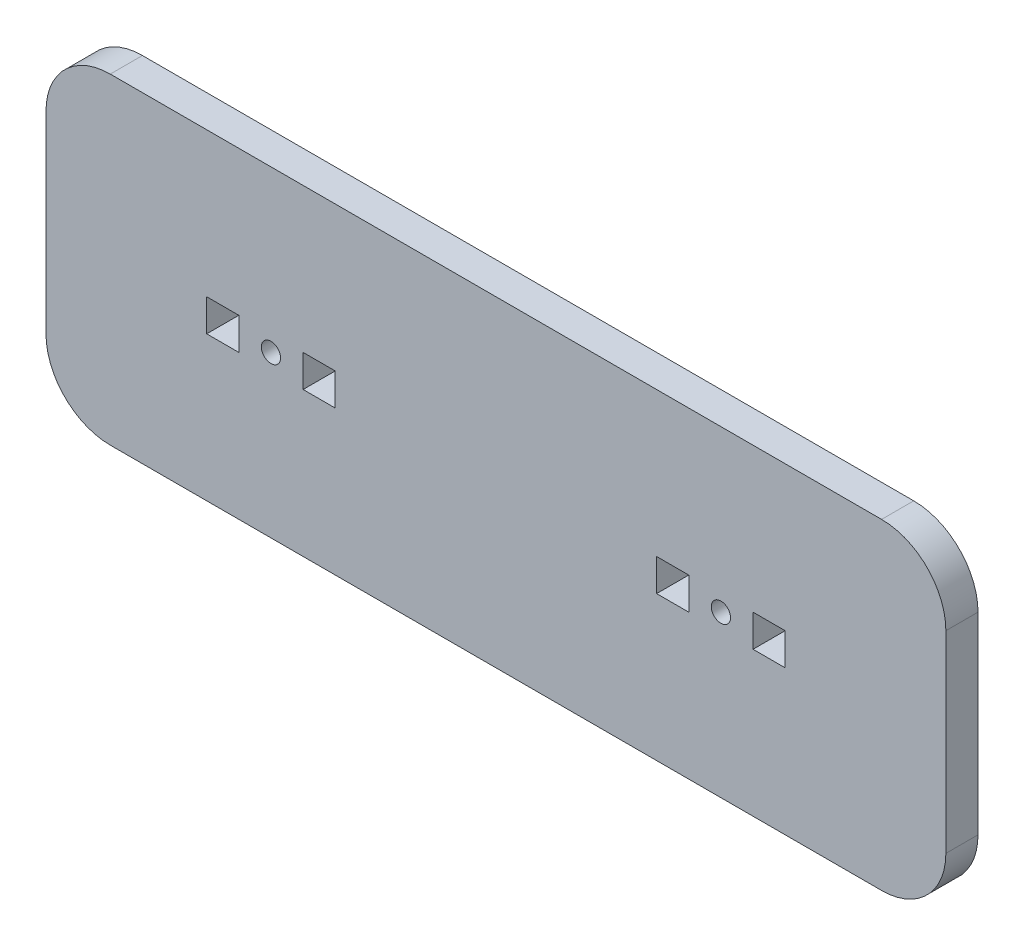
ISO-10303-21;
HEADER;
FILE_DESCRIPTION(('STEP AP214'),'2;1');
FILE_NAME('part.step','',(''),(''),'','','');
FILE_SCHEMA(('AUTOMOTIVE_DESIGN { 1 0 10303 214 1 1 1 1 }'));
ENDSEC;
DATA;
#1=APPLICATION_CONTEXT('core data for automotive mechanical design processes');
#2=APPLICATION_PROTOCOL_DEFINITION('international standard','automotive_design',2000,#1);
#3=PRODUCT_CONTEXT('',#1,'mechanical');
#4=PRODUCT('Part','Part','',(#3));
#5=PRODUCT_RELATED_PRODUCT_CATEGORY('part','',(#4));
#6=PRODUCT_DEFINITION_FORMATION('','',#4);
#7=PRODUCT_DEFINITION_CONTEXT('part definition',#1,'design');
#8=PRODUCT_DEFINITION('design','',#6,#7);
#9=PRODUCT_DEFINITION_SHAPE('','',#8);
#10=(LENGTH_UNIT() NAMED_UNIT(*) SI_UNIT(.MILLI.,.METRE.));
#11=(NAMED_UNIT(*) PLANE_ANGLE_UNIT() SI_UNIT($,.RADIAN.));
#12=(NAMED_UNIT(*) SI_UNIT($,.STERADIAN.) SOLID_ANGLE_UNIT());
#13=UNCERTAINTY_MEASURE_WITH_UNIT(LENGTH_MEASURE(1.E-05),#10,'distance_accuracy_value','');
#14=(GEOMETRIC_REPRESENTATION_CONTEXT(3) GLOBAL_UNCERTAINTY_ASSIGNED_CONTEXT((#13)) GLOBAL_UNIT_ASSIGNED_CONTEXT((#10,
#11,#12)) REPRESENTATION_CONTEXT('',''));
#15=CARTESIAN_POINT('',(0.,0.,0.));
#16=DIRECTION('',(0.,0.,1.));
#17=DIRECTION('',(1.,0.,0.));
#18=AXIS2_PLACEMENT_3D('',#15,#16,#17);
#19=CARTESIAN_POINT('',(0.,0.,5.));
#20=DIRECTION('',(0.,0.,-1.));
#21=DIRECTION('',(-1.,0.,0.));
#22=AXIS2_PLACEMENT_3D('',#19,#20,#21);
#23=PLANE('',#22);
#24=DIRECTION('',(0.,1.,0.));
#25=VECTOR('',#24,1.);
#26=CARTESIAN_POINT('',(-39.9999999999996,2.49999999999989,5.));
#27=LINE('',#26,#25);
#28=CARTESIAN_POINT('',(-39.9999999999996,-2.50000000000011,5.));
#29=VERTEX_POINT('',#28);
#30=CARTESIAN_POINT('',(-39.9999999999996,2.49999999999989,5.));
#31=VERTEX_POINT('',#30);
#32=EDGE_CURVE('E240',#29,#31,#27,.T.);
#33=ORIENTED_EDGE('',*,*,#32,.F.);
#34=DIRECTION('',(1.,0.,0.));
#35=VECTOR('',#34,1.);
#36=CARTESIAN_POINT('',(-39.9999999999996,-2.50000000000011,5.));
#37=LINE('',#36,#35);
#38=CARTESIAN_POINT('',(-44.9999999999996,-2.50000000000011,5.));
#39=VERTEX_POINT('',#38);
#40=EDGE_CURVE('E248',#39,#29,#37,.T.);
#41=ORIENTED_EDGE('',*,*,#40,.F.);
#42=DIRECTION('',(0.,-1.,0.));
#43=VECTOR('',#42,1.);
#44=CARTESIAN_POINT('',(-44.9999999999996,2.49999999999989,5.));
#45=LINE('',#44,#43);
#46=CARTESIAN_POINT('',(-44.9999999999996,2.49999999999989,5.));
#47=VERTEX_POINT('',#46);
#48=EDGE_CURVE('E245',#47,#39,#45,.T.);
#49=ORIENTED_EDGE('',*,*,#48,.F.);
#50=DIRECTION('',(-1.,0.,0.));
#51=VECTOR('',#50,1.);
#52=CARTESIAN_POINT('',(-39.9999999999996,2.49999999999989,5.));
#53=LINE('',#52,#51);
#54=EDGE_CURVE('E242',#31,#47,#53,.T.);
#55=ORIENTED_EDGE('',*,*,#54,.F.);
#56=EDGE_LOOP('',(#33,#41,#49,#55));
#57=FACE_BOUND('',#56,.T.);
#58=DIRECTION('',(0.,1.,0.));
#59=VECTOR('',#58,1.);
#60=CARTESIAN_POINT('',(30.0000000000004,2.4999999999999,5.));
#61=LINE('',#60,#59);
#62=CARTESIAN_POINT('',(30.0000000000004,-2.5000000000001,5.));
#63=VERTEX_POINT('',#62);
#64=CARTESIAN_POINT('',(30.0000000000004,2.4999999999999,5.));
#65=VERTEX_POINT('',#64);
#66=EDGE_CURVE('E308',#63,#65,#61,.T.);
#67=ORIENTED_EDGE('',*,*,#66,.F.);
#68=DIRECTION('',(1.,0.,0.));
#69=VECTOR('',#68,1.);
#70=CARTESIAN_POINT('',(30.0000000000004,-2.5000000000001,5.));
#71=LINE('',#70,#69);
#72=CARTESIAN_POINT('',(25.0000000000004,-2.5000000000001,5.));
#73=VERTEX_POINT('',#72);
#74=EDGE_CURVE('E316',#73,#63,#71,.T.);
#75=ORIENTED_EDGE('',*,*,#74,.F.);
#76=DIRECTION('',(0.,-1.,0.));
#77=VECTOR('',#76,1.);
#78=CARTESIAN_POINT('',(25.0000000000004,2.4999999999999,5.));
#79=LINE('',#78,#77);
#80=CARTESIAN_POINT('',(25.0000000000004,2.4999999999999,5.));
#81=VERTEX_POINT('',#80);
#82=EDGE_CURVE('E313',#81,#73,#79,.T.);
#83=ORIENTED_EDGE('',*,*,#82,.F.);
#84=DIRECTION('',(-1.,0.,0.));
#85=VECTOR('',#84,1.);
#86=CARTESIAN_POINT('',(30.0000000000004,2.4999999999999,5.));
#87=LINE('',#86,#85);
#88=EDGE_CURVE('E310',#65,#81,#87,.T.);
#89=ORIENTED_EDGE('',*,*,#88,.F.);
#90=EDGE_LOOP('',(#67,#75,#83,#89));
#91=FACE_BOUND('',#90,.T.);
#92=DIRECTION('',(0.,-1.,0.));
#93=VECTOR('',#92,1.);
#94=CARTESIAN_POINT('',(-70.,-25.,5.));
#95=LINE('',#94,#93);
#96=CARTESIAN_POINT('',(-70.,15.,5.));
#97=VERTEX_POINT('',#96);
#98=CARTESIAN_POINT('',(-70.,-15.,5.));
#99=VERTEX_POINT('',#98);
#100=EDGE_CURVE('E344',#97,#99,#95,.T.);
#101=ORIENTED_EDGE('',*,*,#100,.T.);
#102=CARTESIAN_POINT('',(-60.,-15.,5.));
#103=DIRECTION('',(0.,0.,-1.));
#104=DIRECTION('',(-1.,0.,0.));
#105=AXIS2_PLACEMENT_3D('',#102,#103,#104);
#106=CIRCLE('',#105,10.);
#107=CARTESIAN_POINT('',(-60.,-25.,5.));
#108=VERTEX_POINT('',#107);
#109=EDGE_CURVE('E382',#99,#108,#106,.F.);
#110=ORIENTED_EDGE('',*,*,#109,.T.);
#111=DIRECTION('',(1.,0.,0.));
#112=VECTOR('',#111,1.);
#113=CARTESIAN_POINT('',(-70.,-25.,5.));
#114=LINE('',#113,#112);
#115=CARTESIAN_POINT('',(60.,-25.,5.));
#116=VERTEX_POINT('',#115);
#117=EDGE_CURVE('E347',#108,#116,#114,.T.);
#118=ORIENTED_EDGE('',*,*,#117,.T.);
#119=CARTESIAN_POINT('',(60.,-15.,5.));
#120=DIRECTION('',(0.,0.,-1.));
#121=DIRECTION('',(-1.,0.,0.));
#122=AXIS2_PLACEMENT_3D('',#119,#120,#121);
#123=CIRCLE('',#122,10.);
#124=CARTESIAN_POINT('',(70.,-15.,5.));
#125=VERTEX_POINT('',#124);
#126=EDGE_CURVE('E380',#116,#125,#123,.F.);
#127=ORIENTED_EDGE('',*,*,#126,.T.);
#128=DIRECTION('',(0.,1.,0.));
#129=VECTOR('',#128,1.);
#130=CARTESIAN_POINT('',(70.,-25.,5.));
#131=LINE('',#130,#129);
#132=CARTESIAN_POINT('',(70.,15.,5.));
#133=VERTEX_POINT('',#132);
#134=EDGE_CURVE('E339',#125,#133,#131,.T.);
#135=ORIENTED_EDGE('',*,*,#134,.T.);
#136=CARTESIAN_POINT('',(60.,15.,5.));
#137=DIRECTION('',(0.,0.,-1.));
#138=DIRECTION('',(-1.,0.,0.));
#139=AXIS2_PLACEMENT_3D('',#136,#137,#138);
#140=CIRCLE('',#139,10.);
#141=CARTESIAN_POINT('',(60.,25.,5.));
#142=VERTEX_POINT('',#141);
#143=EDGE_CURVE('E54',#133,#142,#140,.F.);
#144=ORIENTED_EDGE('',*,*,#143,.T.);
#145=DIRECTION('',(-1.,0.,0.));
#146=VECTOR('',#145,1.);
#147=CARTESIAN_POINT('',(-70.,25.,5.));
#148=LINE('',#147,#146);
#149=CARTESIAN_POINT('',(-60.,25.,5.));
#150=VERTEX_POINT('',#149);
#151=EDGE_CURVE('E341',#142,#150,#148,.T.);
#152=ORIENTED_EDGE('',*,*,#151,.T.);
#153=CARTESIAN_POINT('',(-60.,15.,5.));
#154=DIRECTION('',(0.,0.,-1.));
#155=DIRECTION('',(-1.,0.,0.));
#156=AXIS2_PLACEMENT_3D('',#153,#154,#155);
#157=CIRCLE('',#156,10.);
#158=EDGE_CURVE('E377',#150,#97,#157,.F.);
#159=ORIENTED_EDGE('',*,*,#158,.T.);
#160=EDGE_LOOP('',(#101,#110,#118,#127,#135,#144,#152,#159));
#161=FACE_BOUND('',#160,.T.);
#162=DIRECTION('',(0.,-1.,0.));
#163=VECTOR('',#162,1.);
#164=CARTESIAN_POINT('',(40.0000000000004,2.4999999999999,5.));
#165=LINE('',#164,#163);
#166=CARTESIAN_POINT('',(40.0000000000004,2.4999999999999,5.));
#167=VERTEX_POINT('',#166);
#168=CARTESIAN_POINT('',(40.0000000000004,-2.5000000000001,5.));
#169=VERTEX_POINT('',#168);
#170=EDGE_CURVE('E277',#167,#169,#165,.T.);
#171=ORIENTED_EDGE('',*,*,#170,.F.);
#172=DIRECTION('',(-1.,0.,0.));
#173=VECTOR('',#172,1.);
#174=CARTESIAN_POINT('',(40.0000000000004,2.4999999999999,5.));
#175=LINE('',#174,#173);
#176=CARTESIAN_POINT('',(45.0000000000004,2.4999999999999,5.));
#177=VERTEX_POINT('',#176);
#178=EDGE_CURVE('E285',#177,#167,#175,.T.);
#179=ORIENTED_EDGE('',*,*,#178,.F.);
#180=DIRECTION('',(0.,1.,0.));
#181=VECTOR('',#180,1.);
#182=CARTESIAN_POINT('',(45.0000000000004,2.4999999999999,5.));
#183=LINE('',#182,#181);
#184=CARTESIAN_POINT('',(45.0000000000004,-2.5000000000001,5.));
#185=VERTEX_POINT('',#184);
#186=EDGE_CURVE('E282',#185,#177,#183,.T.);
#187=ORIENTED_EDGE('',*,*,#186,.F.);
#188=DIRECTION('',(1.,0.,0.));
#189=VECTOR('',#188,1.);
#190=CARTESIAN_POINT('',(40.0000000000004,-2.5000000000001,5.));
#191=LINE('',#190,#189);
#192=EDGE_CURVE('E279',#169,#185,#191,.T.);
#193=ORIENTED_EDGE('',*,*,#192,.F.);
#194=EDGE_LOOP('',(#171,#179,#187,#193));
#195=FACE_BOUND('',#194,.T.);
#196=CARTESIAN_POINT('',(35.0000000000004,-1.01516726870717E-13,5.));
#197=DIRECTION('',(0.,0.,1.));
#198=DIRECTION('',(1.,0.,0.));
#199=AXIS2_PLACEMENT_3D('',#196,#197,#198);
#200=CIRCLE('',#199,1.5);
#201=CARTESIAN_POINT('',(36.5000000000004,-1.01516726870717E-13,5.));
#202=VERTEX_POINT('',#201);
#203=EDGE_CURVE('E271',#202,#202,#200,.T.);
#204=ORIENTED_EDGE('',*,*,#203,.F.);
#205=EDGE_LOOP('',(#204));
#206=FACE_BOUND('',#205,.T.);
#207=DIRECTION('',(0.,-1.,0.));
#208=VECTOR('',#207,1.);
#209=CARTESIAN_POINT('',(-29.9999999999996,2.49999999999989,5.));
#210=LINE('',#209,#208);
#211=CARTESIAN_POINT('',(-29.9999999999996,2.49999999999989,5.));
#212=VERTEX_POINT('',#211);
#213=CARTESIAN_POINT('',(-29.9999999999996,-2.50000000000011,5.));
#214=VERTEX_POINT('',#213);
#215=EDGE_CURVE('E196',#212,#214,#210,.T.);
#216=ORIENTED_EDGE('',*,*,#215,.F.);
#217=DIRECTION('',(-1.,0.,0.));
#218=VECTOR('',#217,1.);
#219=CARTESIAN_POINT('',(-29.9999999999996,2.49999999999989,5.));
#220=LINE('',#219,#218);
#221=CARTESIAN_POINT('',(-24.9999999999996,2.49999999999989,5.));
#222=VERTEX_POINT('',#221);
#223=EDGE_CURVE('E222',#222,#212,#220,.T.);
#224=ORIENTED_EDGE('',*,*,#223,.F.);
#225=DIRECTION('',(0.,1.,0.));
#226=VECTOR('',#225,1.);
#227=CARTESIAN_POINT('',(-24.9999999999996,2.49999999999989,5.));
#228=LINE('',#227,#226);
#229=CARTESIAN_POINT('',(-24.9999999999996,-2.50000000000011,5.));
#230=VERTEX_POINT('',#229);
#231=EDGE_CURVE('E220',#230,#222,#228,.T.);
#232=ORIENTED_EDGE('',*,*,#231,.F.);
#233=DIRECTION('',(1.,0.,0.));
#234=VECTOR('',#233,1.);
#235=CARTESIAN_POINT('',(-29.9999999999996,-2.50000000000011,5.));
#236=LINE('',#235,#234);
#237=EDGE_CURVE('E206',#214,#230,#236,.T.);
#238=ORIENTED_EDGE('',*,*,#237,.F.);
#239=EDGE_LOOP('',(#216,#224,#232,#238));
#240=FACE_BOUND('',#239,.T.);
#241=CARTESIAN_POINT('',(-34.9999999999996,-1.08268408934466E-13,5.));
#242=DIRECTION('',(0.,0.,1.));
#243=DIRECTION('',(1.,0.,0.));
#244=AXIS2_PLACEMENT_3D('',#241,#242,#243);
#245=CIRCLE('',#244,1.5);
#246=CARTESIAN_POINT('',(-33.4999999999996,-1.08268408934466E-13,5.));
#247=VERTEX_POINT('',#246);
#248=EDGE_CURVE('E229',#247,#247,#245,.T.);
#249=ORIENTED_EDGE('',*,*,#248,.F.);
#250=EDGE_LOOP('',(#249));
#251=FACE_BOUND('',#250,.T.);
#252=ADVANCED_FACE('F33',(#57,#91,#161,#195,#206,#240,#251),#23,.F.);
#253=CARTESIAN_POINT('',(0.,0.,0.));
#254=DIRECTION('',(0.,0.,-1.));
#255=DIRECTION('',(-1.,0.,0.));
#256=AXIS2_PLACEMENT_3D('',#253,#254,#255);
#257=PLANE('',#256);
#258=DIRECTION('',(-1.,0.,0.));
#259=VECTOR('',#258,1.);
#260=CARTESIAN_POINT('',(-29.9999999999996,2.49999999999989,0.));
#261=LINE('',#260,#259);
#262=CARTESIAN_POINT('',(-24.9999999999996,2.49999999999989,0.));
#263=VERTEX_POINT('',#262);
#264=CARTESIAN_POINT('',(-29.9999999999996,2.49999999999989,0.));
#265=VERTEX_POINT('',#264);
#266=EDGE_CURVE('E207',#263,#265,#261,.T.);
#267=ORIENTED_EDGE('',*,*,#266,.T.);
#268=DIRECTION('',(0.,-1.,0.));
#269=VECTOR('',#268,1.);
#270=CARTESIAN_POINT('',(-29.9999999999996,2.49999999999989,0.));
#271=LINE('',#270,#269);
#272=CARTESIAN_POINT('',(-29.9999999999996,-2.50000000000011,0.));
#273=VERTEX_POINT('',#272);
#274=EDGE_CURVE('E227',#265,#273,#271,.T.);
#275=ORIENTED_EDGE('',*,*,#274,.T.);
#276=DIRECTION('',(1.,0.,0.));
#277=VECTOR('',#276,1.);
#278=CARTESIAN_POINT('',(-29.9999999999996,-2.50000000000011,0.));
#279=LINE('',#278,#277);
#280=CARTESIAN_POINT('',(-24.9999999999996,-2.50000000000011,0.));
#281=VERTEX_POINT('',#280);
#282=EDGE_CURVE('E213',#273,#281,#279,.T.);
#283=ORIENTED_EDGE('',*,*,#282,.T.);
#284=DIRECTION('',(0.,1.,0.));
#285=VECTOR('',#284,1.);
#286=CARTESIAN_POINT('',(-24.9999999999996,2.49999999999989,0.));
#287=LINE('',#286,#285);
#288=EDGE_CURVE('E231',#281,#263,#287,.T.);
#289=ORIENTED_EDGE('',*,*,#288,.T.);
#290=EDGE_LOOP('',(#267,#275,#283,#289));
#291=FACE_BOUND('',#290,.T.);
#292=DIRECTION('',(1.,0.,0.));
#293=VECTOR('',#292,1.);
#294=CARTESIAN_POINT('',(-39.9999999999996,-2.50000000000011,0.));
#295=LINE('',#294,#293);
#296=CARTESIAN_POINT('',(-44.9999999999996,-2.50000000000011,0.));
#297=VERTEX_POINT('',#296);
#298=CARTESIAN_POINT('',(-39.9999999999996,-2.50000000000011,0.));
#299=VERTEX_POINT('',#298);
#300=EDGE_CURVE('E243',#297,#299,#295,.T.);
#301=ORIENTED_EDGE('',*,*,#300,.T.);
#302=DIRECTION('',(0.,1.,0.));
#303=VECTOR('',#302,1.);
#304=CARTESIAN_POINT('',(-39.9999999999996,2.49999999999989,0.));
#305=LINE('',#304,#303);
#306=CARTESIAN_POINT('',(-39.9999999999996,2.49999999999989,0.));
#307=VERTEX_POINT('',#306);
#308=EDGE_CURVE('E214',#299,#307,#305,.T.);
#309=ORIENTED_EDGE('',*,*,#308,.T.);
#310=DIRECTION('',(-1.,0.,0.));
#311=VECTOR('',#310,1.);
#312=CARTESIAN_POINT('',(-39.9999999999996,2.49999999999989,0.));
#313=LINE('',#312,#311);
#314=CARTESIAN_POINT('',(-44.9999999999996,2.49999999999989,0.));
#315=VERTEX_POINT('',#314);
#316=EDGE_CURVE('E253',#307,#315,#313,.T.);
#317=ORIENTED_EDGE('',*,*,#316,.T.);
#318=DIRECTION('',(0.,-1.,0.));
#319=VECTOR('',#318,1.);
#320=CARTESIAN_POINT('',(-44.9999999999996,2.49999999999989,0.));
#321=LINE('',#320,#319);
#322=EDGE_CURVE('E256',#315,#297,#321,.T.);
#323=ORIENTED_EDGE('',*,*,#322,.T.);
#324=EDGE_LOOP('',(#301,#309,#317,#323));
#325=FACE_BOUND('',#324,.T.);
#326=CARTESIAN_POINT('',(35.0000000000004,-1.01516726870717E-13,0.));
#327=DIRECTION('',(0.,0.,1.));
#328=DIRECTION('',(1.,0.,0.));
#329=AXIS2_PLACEMENT_3D('',#326,#327,#328);
#330=CIRCLE('',#329,1.5);
#331=CARTESIAN_POINT('',(36.5000000000004,-1.01516726870717E-13,0.));
#332=VERTEX_POINT('',#331);
#333=EDGE_CURVE('E270',#332,#332,#330,.T.);
#334=ORIENTED_EDGE('',*,*,#333,.T.);
#335=EDGE_LOOP('',(#334));
#336=FACE_BOUND('',#335,.T.);
#337=DIRECTION('',(1.,0.,0.));
#338=VECTOR('',#337,1.);
#339=CARTESIAN_POINT('',(-70.,-25.,0.));
#340=LINE('',#339,#338);
#341=CARTESIAN_POINT('',(-60.,-25.,0.));
#342=VERTEX_POINT('',#341);
#343=CARTESIAN_POINT('',(60.,-25.,0.));
#344=VERTEX_POINT('',#343);
#345=EDGE_CURVE('E342',#342,#344,#340,.T.);
#346=ORIENTED_EDGE('',*,*,#345,.F.);
#347=CARTESIAN_POINT('',(-60.,-15.,0.));
#348=DIRECTION('',(0.,0.,-1.));
#349=DIRECTION('',(-1.,0.,0.));
#350=AXIS2_PLACEMENT_3D('',#347,#348,#349);
#351=CIRCLE('',#350,10.);
#352=CARTESIAN_POINT('',(-70.,-15.,0.));
#353=VERTEX_POINT('',#352);
#354=EDGE_CURVE('E370',#342,#353,#351,.T.);
#355=ORIENTED_EDGE('',*,*,#354,.T.);
#356=DIRECTION('',(0.,-1.,0.));
#357=VECTOR('',#356,1.);
#358=CARTESIAN_POINT('',(-70.,-25.,0.));
#359=LINE('',#358,#357);
#360=CARTESIAN_POINT('',(-70.,15.,0.));
#361=VERTEX_POINT('',#360);
#362=EDGE_CURVE('E355',#361,#353,#359,.T.);
#363=ORIENTED_EDGE('',*,*,#362,.F.);
#364=CARTESIAN_POINT('',(-60.,15.,0.));
#365=DIRECTION('',(0.,0.,-1.));
#366=DIRECTION('',(-1.,0.,0.));
#367=AXIS2_PLACEMENT_3D('',#364,#365,#366);
#368=CIRCLE('',#367,10.);
#369=CARTESIAN_POINT('',(-60.,25.,0.));
#370=VERTEX_POINT('',#369);
#371=EDGE_CURVE('E364',#361,#370,#368,.T.);
#372=ORIENTED_EDGE('',*,*,#371,.T.);
#373=DIRECTION('',(-1.,0.,0.));
#374=VECTOR('',#373,1.);
#375=CARTESIAN_POINT('',(-70.,25.,0.));
#376=LINE('',#375,#374);
#377=CARTESIAN_POINT('',(60.,25.,0.));
#378=VERTEX_POINT('',#377);
#379=EDGE_CURVE('E353',#378,#370,#376,.T.);
#380=ORIENTED_EDGE('',*,*,#379,.F.);
#381=CARTESIAN_POINT('',(60.,15.,0.));
#382=DIRECTION('',(0.,0.,-1.));
#383=DIRECTION('',(-1.,0.,0.));
#384=AXIS2_PLACEMENT_3D('',#381,#382,#383);
#385=CIRCLE('',#384,10.);
#386=CARTESIAN_POINT('',(70.,15.,0.));
#387=VERTEX_POINT('',#386);
#388=EDGE_CURVE('E366',#378,#387,#385,.T.);
#389=ORIENTED_EDGE('',*,*,#388,.T.);
#390=DIRECTION('',(0.,1.,0.));
#391=VECTOR('',#390,1.);
#392=CARTESIAN_POINT('',(70.,-25.,0.));
#393=LINE('',#392,#391);
#394=CARTESIAN_POINT('',(70.,-15.,0.));
#395=VERTEX_POINT('',#394);
#396=EDGE_CURVE('E338',#395,#387,#393,.T.);
#397=ORIENTED_EDGE('',*,*,#396,.F.);
#398=CARTESIAN_POINT('',(60.,-15.,0.));
#399=DIRECTION('',(0.,0.,-1.));
#400=DIRECTION('',(-1.,0.,0.));
#401=AXIS2_PLACEMENT_3D('',#398,#399,#400);
#402=CIRCLE('',#401,10.);
#403=EDGE_CURVE('E368',#395,#344,#402,.T.);
#404=ORIENTED_EDGE('',*,*,#403,.T.);
#405=EDGE_LOOP('',(#346,#355,#363,#372,#380,#389,#397,#404));
#406=FACE_BOUND('',#405,.T.);
#407=DIRECTION('',(1.,0.,0.));
#408=VECTOR('',#407,1.);
#409=CARTESIAN_POINT('',(30.0000000000004,-2.5000000000001,0.));
#410=LINE('',#409,#408);
#411=CARTESIAN_POINT('',(25.0000000000004,-2.5000000000001,0.));
#412=VERTEX_POINT('',#411);
#413=CARTESIAN_POINT('',(30.0000000000004,-2.5000000000001,0.));
#414=VERTEX_POINT('',#413);
#415=EDGE_CURVE('E311',#412,#414,#410,.T.);
#416=ORIENTED_EDGE('',*,*,#415,.T.);
#417=DIRECTION('',(0.,1.,0.));
#418=VECTOR('',#417,1.);
#419=CARTESIAN_POINT('',(30.0000000000004,2.4999999999999,0.));
#420=LINE('',#419,#418);
#421=CARTESIAN_POINT('',(30.0000000000004,2.4999999999999,0.));
#422=VERTEX_POINT('',#421);
#423=EDGE_CURVE('E307',#414,#422,#420,.T.);
#424=ORIENTED_EDGE('',*,*,#423,.T.);
#425=DIRECTION('',(-1.,0.,0.));
#426=VECTOR('',#425,1.);
#427=CARTESIAN_POINT('',(30.0000000000004,2.4999999999999,0.));
#428=LINE('',#427,#426);
#429=CARTESIAN_POINT('',(25.0000000000004,2.4999999999999,0.));
#430=VERTEX_POINT('',#429);
#431=EDGE_CURVE('E321',#422,#430,#428,.T.);
#432=ORIENTED_EDGE('',*,*,#431,.T.);
#433=DIRECTION('',(0.,-1.,0.));
#434=VECTOR('',#433,1.);
#435=CARTESIAN_POINT('',(25.0000000000004,2.4999999999999,0.));
#436=LINE('',#435,#434);
#437=EDGE_CURVE('E324',#430,#412,#436,.T.);
#438=ORIENTED_EDGE('',*,*,#437,.T.);
#439=EDGE_LOOP('',(#416,#424,#432,#438));
#440=FACE_BOUND('',#439,.T.);
#441=DIRECTION('',(-1.,0.,0.));
#442=VECTOR('',#441,1.);
#443=CARTESIAN_POINT('',(40.0000000000004,2.4999999999999,0.));
#444=LINE('',#443,#442);
#445=CARTESIAN_POINT('',(45.0000000000004,2.4999999999999,0.));
#446=VERTEX_POINT('',#445);
#447=CARTESIAN_POINT('',(40.0000000000004,2.4999999999999,0.));
#448=VERTEX_POINT('',#447);
#449=EDGE_CURVE('E280',#446,#448,#444,.T.);
#450=ORIENTED_EDGE('',*,*,#449,.T.);
#451=DIRECTION('',(0.,-1.,0.));
#452=VECTOR('',#451,1.);
#453=CARTESIAN_POINT('',(40.0000000000004,2.4999999999999,0.));
#454=LINE('',#453,#452);
#455=CARTESIAN_POINT('',(40.0000000000004,-2.5000000000001,0.));
#456=VERTEX_POINT('',#455);
#457=EDGE_CURVE('E274',#448,#456,#454,.T.);
#458=ORIENTED_EDGE('',*,*,#457,.T.);
#459=DIRECTION('',(1.,0.,0.));
#460=VECTOR('',#459,1.);
#461=CARTESIAN_POINT('',(40.0000000000004,-2.5000000000001,0.));
#462=LINE('',#461,#460);
#463=CARTESIAN_POINT('',(45.0000000000004,-2.5000000000001,0.));
#464=VERTEX_POINT('',#463);
#465=EDGE_CURVE('E290',#456,#464,#462,.T.);
#466=ORIENTED_EDGE('',*,*,#465,.T.);
#467=DIRECTION('',(0.,1.,0.));
#468=VECTOR('',#467,1.);
#469=CARTESIAN_POINT('',(45.0000000000004,2.4999999999999,0.));
#470=LINE('',#469,#468);
#471=EDGE_CURVE('E293',#464,#446,#470,.T.);
#472=ORIENTED_EDGE('',*,*,#471,.T.);
#473=EDGE_LOOP('',(#450,#458,#466,#472));
#474=FACE_BOUND('',#473,.T.);
#475=CARTESIAN_POINT('',(-34.9999999999996,-1.08268408934466E-13,0.));
#476=DIRECTION('',(0.,0.,1.));
#477=DIRECTION('',(1.,0.,0.));
#478=AXIS2_PLACEMENT_3D('',#475,#476,#477);
#479=CIRCLE('',#478,1.5);
#480=CARTESIAN_POINT('',(-33.4999999999996,-1.08268408934466E-13,0.));
#481=VERTEX_POINT('',#480);
#482=EDGE_CURVE('E686',#481,#481,#479,.T.);
#483=ORIENTED_EDGE('',*,*,#482,.T.);
#484=EDGE_LOOP('',(#483));
#485=FACE_BOUND('',#484,.T.);
#486=ADVANCED_FACE('F398',(#291,#325,#336,#406,#440,#474,#485),#257,.T.);
#487=CARTESIAN_POINT('',(70.,-25.,5.));
#488=DIRECTION('',(-1.,0.,0.));
#489=DIRECTION('',(0.,0.,1.));
#490=AXIS2_PLACEMENT_3D('',#487,#488,#489);
#491=PLANE('',#490);
#492=ORIENTED_EDGE('',*,*,#134,.F.);
#493=DIRECTION('',(0.,0.,-1.));
#494=VECTOR('',#493,1.);
#495=CARTESIAN_POINT('',(70.,-15.,5.));
#496=LINE('',#495,#494);
#497=EDGE_CURVE('E386',#125,#395,#496,.T.);
#498=ORIENTED_EDGE('',*,*,#497,.T.);
#499=ORIENTED_EDGE('',*,*,#396,.T.);
#500=DIRECTION('',(0.,0.,-1.));
#501=VECTOR('',#500,1.);
#502=CARTESIAN_POINT('',(70.,15.,5.));
#503=LINE('',#502,#501);
#504=EDGE_CURVE('E384',#387,#133,#503,.F.);
#505=ORIENTED_EDGE('',*,*,#504,.T.);
#506=EDGE_LOOP('',(#492,#498,#499,#505));
#507=FACE_BOUND('',#506,.T.);
#508=ADVANCED_FACE('F392',(#507),#491,.F.);
#509=CARTESIAN_POINT('',(-70.,25.,5.));
#510=DIRECTION('',(0.,-1.,0.));
#511=DIRECTION('',(1.,0.,0.));
#512=AXIS2_PLACEMENT_3D('',#509,#510,#511);
#513=PLANE('',#512);
#514=ORIENTED_EDGE('',*,*,#151,.F.);
#515=DIRECTION('',(0.,0.,-1.));
#516=VECTOR('',#515,1.);
#517=CARTESIAN_POINT('',(60.,25.,5.));
#518=LINE('',#517,#516);
#519=EDGE_CURVE('E11',#142,#378,#518,.T.);
#520=ORIENTED_EDGE('',*,*,#519,.T.);
#521=ORIENTED_EDGE('',*,*,#379,.T.);
#522=DIRECTION('',(0.,0.,-1.));
#523=VECTOR('',#522,1.);
#524=CARTESIAN_POINT('',(-60.,25.,5.));
#525=LINE('',#524,#523);
#526=EDGE_CURVE('E41',#370,#150,#525,.F.);
#527=ORIENTED_EDGE('',*,*,#526,.T.);
#528=EDGE_LOOP('',(#514,#520,#521,#527));
#529=FACE_BOUND('',#528,.T.);
#530=ADVANCED_FACE('F404',(#529),#513,.F.);
#531=CARTESIAN_POINT('',(-70.,-25.,5.));
#532=DIRECTION('',(1.,0.,0.));
#533=DIRECTION('',(0.,0.,-1.));
#534=AXIS2_PLACEMENT_3D('',#531,#532,#533);
#535=PLANE('',#534);
#536=ORIENTED_EDGE('',*,*,#362,.T.);
#537=DIRECTION('',(0.,0.,-1.));
#538=VECTOR('',#537,1.);
#539=CARTESIAN_POINT('',(-70.,-15.,5.));
#540=LINE('',#539,#538);
#541=EDGE_CURVE('E375',#353,#99,#540,.F.);
#542=ORIENTED_EDGE('',*,*,#541,.T.);
#543=ORIENTED_EDGE('',*,*,#100,.F.);
#544=DIRECTION('',(0.,0.,-1.));
#545=VECTOR('',#544,1.);
#546=CARTESIAN_POINT('',(-70.,15.,5.));
#547=LINE('',#546,#545);
#548=EDGE_CURVE('E372',#97,#361,#547,.T.);
#549=ORIENTED_EDGE('',*,*,#548,.T.);
#550=EDGE_LOOP('',(#536,#542,#543,#549));
#551=FACE_BOUND('',#550,.T.);
#552=ADVANCED_FACE('F412',(#551),#535,.F.);
#553=CARTESIAN_POINT('',(-70.,-25.,5.));
#554=DIRECTION('',(0.,1.,0.));
#555=DIRECTION('',(0.,0.,1.));
#556=AXIS2_PLACEMENT_3D('',#553,#554,#555);
#557=PLANE('',#556);
#558=ORIENTED_EDGE('',*,*,#117,.F.);
#559=DIRECTION('',(0.,0.,-1.));
#560=VECTOR('',#559,1.);
#561=CARTESIAN_POINT('',(-60.,-25.,5.));
#562=LINE('',#561,#560);
#563=EDGE_CURVE('E361',#108,#342,#562,.T.);
#564=ORIENTED_EDGE('',*,*,#563,.T.);
#565=ORIENTED_EDGE('',*,*,#345,.T.);
#566=DIRECTION('',(0.,0.,-1.));
#567=VECTOR('',#566,1.);
#568=CARTESIAN_POINT('',(60.,-25.,5.));
#569=LINE('',#568,#567);
#570=EDGE_CURVE('E350',#344,#116,#569,.F.);
#571=ORIENTED_EDGE('',*,*,#570,.T.);
#572=EDGE_LOOP('',(#558,#564,#565,#571));
#573=FACE_BOUND('',#572,.T.);
#574=ADVANCED_FACE('F420',(#573),#557,.F.);
#575=CARTESIAN_POINT('',(30.0000000000004,2.4999999999999,5.));
#576=DIRECTION('',(-1.,0.,0.));
#577=DIRECTION('',(0.,0.,1.));
#578=AXIS2_PLACEMENT_3D('',#575,#576,#577);
#579=PLANE('',#578);
#580=ORIENTED_EDGE('',*,*,#423,.F.);
#581=DIRECTION('',(0.,0.,-1.));
#582=VECTOR('',#581,1.);
#583=CARTESIAN_POINT('',(30.0000000000004,-2.5000000000001,5.));
#584=LINE('',#583,#582);
#585=EDGE_CURVE('E318',#63,#414,#584,.T.);
#586=ORIENTED_EDGE('',*,*,#585,.F.);
#587=ORIENTED_EDGE('',*,*,#66,.T.);
#588=DIRECTION('',(0.,0.,-1.));
#589=VECTOR('',#588,1.);
#590=CARTESIAN_POINT('',(30.0000000000004,2.4999999999999,5.));
#591=LINE('',#590,#589);
#592=EDGE_CURVE('E335',#65,#422,#591,.T.);
#593=ORIENTED_EDGE('',*,*,#592,.T.);
#594=EDGE_LOOP('',(#580,#586,#587,#593));
#595=FACE_BOUND('',#594,.T.);
#596=ADVANCED_FACE('F442',(#595),#579,.T.);
#597=CARTESIAN_POINT('',(30.0000000000004,2.4999999999999,5.));
#598=DIRECTION('',(0.,-1.,0.));
#599=DIRECTION('',(1.,0.,0.));
#600=AXIS2_PLACEMENT_3D('',#597,#598,#599);
#601=PLANE('',#600);
#602=ORIENTED_EDGE('',*,*,#431,.F.);
#603=ORIENTED_EDGE('',*,*,#592,.F.);
#604=ORIENTED_EDGE('',*,*,#88,.T.);
#605=DIRECTION('',(0.,0.,-1.));
#606=VECTOR('',#605,1.);
#607=CARTESIAN_POINT('',(25.0000000000004,2.4999999999999,5.));
#608=LINE('',#607,#606);
#609=EDGE_CURVE('E333',#81,#430,#608,.T.);
#610=ORIENTED_EDGE('',*,*,#609,.T.);
#611=EDGE_LOOP('',(#602,#603,#604,#610));
#612=FACE_BOUND('',#611,.T.);
#613=ADVANCED_FACE('F475',(#612),#601,.T.);
#614=CARTESIAN_POINT('',(25.0000000000004,2.4999999999999,5.));
#615=DIRECTION('',(1.,0.,0.));
#616=DIRECTION('',(0.,0.,-1.));
#617=AXIS2_PLACEMENT_3D('',#614,#615,#616);
#618=PLANE('',#617);
#619=ORIENTED_EDGE('',*,*,#437,.F.);
#620=ORIENTED_EDGE('',*,*,#609,.F.);
#621=ORIENTED_EDGE('',*,*,#82,.T.);
#622=DIRECTION('',(0.,0.,-1.));
#623=VECTOR('',#622,1.);
#624=CARTESIAN_POINT('',(25.0000000000004,-2.5000000000001,5.));
#625=LINE('',#624,#623);
#626=EDGE_CURVE('E331',#73,#412,#625,.T.);
#627=ORIENTED_EDGE('',*,*,#626,.T.);
#628=EDGE_LOOP('',(#619,#620,#621,#627));
#629=FACE_BOUND('',#628,.T.);
#630=ADVANCED_FACE('F482',(#629),#618,.T.);
#631=CARTESIAN_POINT('',(30.0000000000004,-2.5000000000001,5.));
#632=DIRECTION('',(0.,1.,0.));
#633=DIRECTION('',(-1.,0.,0.));
#634=AXIS2_PLACEMENT_3D('',#631,#632,#633);
#635=PLANE('',#634);
#636=ORIENTED_EDGE('',*,*,#415,.F.);
#637=ORIENTED_EDGE('',*,*,#626,.F.);
#638=ORIENTED_EDGE('',*,*,#74,.T.);
#639=ORIENTED_EDGE('',*,*,#585,.T.);
#640=EDGE_LOOP('',(#636,#637,#638,#639));
#641=FACE_BOUND('',#640,.T.);
#642=ADVANCED_FACE('F489',(#641),#635,.T.);
#643=CARTESIAN_POINT('',(40.0000000000004,2.4999999999999,5.));
#644=DIRECTION('',(1.,0.,0.));
#645=DIRECTION('',(0.,0.,-1.));
#646=AXIS2_PLACEMENT_3D('',#643,#644,#645);
#647=PLANE('',#646);
#648=ORIENTED_EDGE('',*,*,#457,.F.);
#649=DIRECTION('',(0.,0.,-1.));
#650=VECTOR('',#649,1.);
#651=CARTESIAN_POINT('',(40.0000000000004,2.4999999999999,5.));
#652=LINE('',#651,#650);
#653=EDGE_CURVE('E287',#167,#448,#652,.T.);
#654=ORIENTED_EDGE('',*,*,#653,.F.);
#655=ORIENTED_EDGE('',*,*,#170,.T.);
#656=DIRECTION('',(0.,0.,-1.));
#657=VECTOR('',#656,1.);
#658=CARTESIAN_POINT('',(40.0000000000004,-2.5000000000001,5.));
#659=LINE('',#658,#657);
#660=EDGE_CURVE('E304',#169,#456,#659,.T.);
#661=ORIENTED_EDGE('',*,*,#660,.T.);
#662=EDGE_LOOP('',(#648,#654,#655,#661));
#663=FACE_BOUND('',#662,.T.);
#664=ADVANCED_FACE('F497',(#663),#647,.T.);
#665=CARTESIAN_POINT('',(40.0000000000004,-2.5000000000001,5.));
#666=DIRECTION('',(0.,1.,0.));
#667=DIRECTION('',(0.,0.,1.));
#668=AXIS2_PLACEMENT_3D('',#665,#666,#667);
#669=PLANE('',#668);
#670=ORIENTED_EDGE('',*,*,#465,.F.);
#671=ORIENTED_EDGE('',*,*,#660,.F.);
#672=ORIENTED_EDGE('',*,*,#192,.T.);
#673=DIRECTION('',(0.,0.,-1.));
#674=VECTOR('',#673,1.);
#675=CARTESIAN_POINT('',(45.0000000000004,-2.5000000000001,5.));
#676=LINE('',#675,#674);
#677=EDGE_CURVE('E302',#185,#464,#676,.T.);
#678=ORIENTED_EDGE('',*,*,#677,.T.);
#679=EDGE_LOOP('',(#670,#671,#672,#678));
#680=FACE_BOUND('',#679,.T.);
#681=ADVANCED_FACE('F505',(#680),#669,.T.);
#682=CARTESIAN_POINT('',(45.0000000000004,2.4999999999999,5.));
#683=DIRECTION('',(-1.,0.,0.));
#684=DIRECTION('',(0.,0.,1.));
#685=AXIS2_PLACEMENT_3D('',#682,#683,#684);
#686=PLANE('',#685);
#687=ORIENTED_EDGE('',*,*,#471,.F.);
#688=ORIENTED_EDGE('',*,*,#677,.F.);
#689=ORIENTED_EDGE('',*,*,#186,.T.);
#690=DIRECTION('',(0.,0.,-1.));
#691=VECTOR('',#690,1.);
#692=CARTESIAN_POINT('',(45.0000000000004,2.4999999999999,5.));
#693=LINE('',#692,#691);
#694=EDGE_CURVE('E300',#177,#446,#693,.T.);
#695=ORIENTED_EDGE('',*,*,#694,.T.);
#696=EDGE_LOOP('',(#687,#688,#689,#695));
#697=FACE_BOUND('',#696,.T.);
#698=ADVANCED_FACE('F513',(#697),#686,.T.);
#699=CARTESIAN_POINT('',(40.0000000000004,2.4999999999999,5.));
#700=DIRECTION('',(0.,-1.,0.));
#701=DIRECTION('',(0.,0.,-1.));
#702=AXIS2_PLACEMENT_3D('',#699,#700,#701);
#703=PLANE('',#702);
#704=ORIENTED_EDGE('',*,*,#449,.F.);
#705=ORIENTED_EDGE('',*,*,#694,.F.);
#706=ORIENTED_EDGE('',*,*,#178,.T.);
#707=ORIENTED_EDGE('',*,*,#653,.T.);
#708=EDGE_LOOP('',(#704,#705,#706,#707));
#709=FACE_BOUND('',#708,.T.);
#710=ADVANCED_FACE('F521',(#709),#703,.T.);
#711=CARTESIAN_POINT('',(35.0000000000004,-1.01516726870717E-13,5.));
#712=DIRECTION('',(0.,0.,-1.));
#713=DIRECTION('',(-1.,0.,0.));
#714=AXIS2_PLACEMENT_3D('',#711,#712,#713);
#715=CYLINDRICAL_SURFACE('',#714,1.5);
#716=ORIENTED_EDGE('',*,*,#203,.T.);
#717=EDGE_LOOP('',(#716));
#718=FACE_BOUND('',#717,.T.);
#719=ORIENTED_EDGE('',*,*,#333,.F.);
#720=EDGE_LOOP('',(#719));
#721=FACE_BOUND('',#720,.T.);
#722=ADVANCED_FACE('F529',(#718,#721),#715,.F.);
#723=CARTESIAN_POINT('',(-39.9999999999996,2.49999999999989,5.));
#724=DIRECTION('',(-1.,0.,0.));
#725=DIRECTION('',(0.,0.,1.));
#726=AXIS2_PLACEMENT_3D('',#723,#724,#725);
#727=PLANE('',#726);
#728=ORIENTED_EDGE('',*,*,#308,.F.);
#729=DIRECTION('',(0.,0.,-1.));
#730=VECTOR('',#729,1.);
#731=CARTESIAN_POINT('',(-39.9999999999996,-2.50000000000011,5.));
#732=LINE('',#731,#730);
#733=EDGE_CURVE('E250',#29,#299,#732,.T.);
#734=ORIENTED_EDGE('',*,*,#733,.F.);
#735=ORIENTED_EDGE('',*,*,#32,.T.);
#736=DIRECTION('',(0.,0.,-1.));
#737=VECTOR('',#736,1.);
#738=CARTESIAN_POINT('',(-39.9999999999996,2.49999999999989,5.));
#739=LINE('',#738,#737);
#740=EDGE_CURVE('E267',#31,#307,#739,.T.);
#741=ORIENTED_EDGE('',*,*,#740,.T.);
#742=EDGE_LOOP('',(#728,#734,#735,#741));
#743=FACE_BOUND('',#742,.T.);
#744=ADVANCED_FACE('F537',(#743),#727,.T.);
#745=CARTESIAN_POINT('',(-39.9999999999996,2.49999999999989,5.));
#746=DIRECTION('',(0.,-1.,0.));
#747=DIRECTION('',(1.,0.,0.));
#748=AXIS2_PLACEMENT_3D('',#745,#746,#747);
#749=PLANE('',#748);
#750=ORIENTED_EDGE('',*,*,#316,.F.);
#751=ORIENTED_EDGE('',*,*,#740,.F.);
#752=ORIENTED_EDGE('',*,*,#54,.T.);
#753=DIRECTION('',(0.,0.,-1.));
#754=VECTOR('',#753,1.);
#755=CARTESIAN_POINT('',(-44.9999999999996,2.49999999999989,5.));
#756=LINE('',#755,#754);
#757=EDGE_CURVE('E265',#47,#315,#756,.T.);
#758=ORIENTED_EDGE('',*,*,#757,.T.);
#759=EDGE_LOOP('',(#750,#751,#752,#758));
#760=FACE_BOUND('',#759,.T.);
#761=ADVANCED_FACE('F545',(#760),#749,.T.);
#762=CARTESIAN_POINT('',(-44.9999999999996,2.49999999999989,5.));
#763=DIRECTION('',(1.,0.,0.));
#764=DIRECTION('',(0.,0.,-1.));
#765=AXIS2_PLACEMENT_3D('',#762,#763,#764);
#766=PLANE('',#765);
#767=ORIENTED_EDGE('',*,*,#322,.F.);
#768=ORIENTED_EDGE('',*,*,#757,.F.);
#769=ORIENTED_EDGE('',*,*,#48,.T.);
#770=DIRECTION('',(0.,0.,-1.));
#771=VECTOR('',#770,1.);
#772=CARTESIAN_POINT('',(-44.9999999999996,-2.50000000000011,5.));
#773=LINE('',#772,#771);
#774=EDGE_CURVE('E263',#39,#297,#773,.T.);
#775=ORIENTED_EDGE('',*,*,#774,.T.);
#776=EDGE_LOOP('',(#767,#768,#769,#775));
#777=FACE_BOUND('',#776,.T.);
#778=ADVANCED_FACE('F553',(#777),#766,.T.);
#779=CARTESIAN_POINT('',(-39.9999999999996,-2.50000000000011,5.));
#780=DIRECTION('',(0.,1.,0.));
#781=DIRECTION('',(-1.,0.,0.));
#782=AXIS2_PLACEMENT_3D('',#779,#780,#781);
#783=PLANE('',#782);
#784=ORIENTED_EDGE('',*,*,#300,.F.);
#785=ORIENTED_EDGE('',*,*,#774,.F.);
#786=ORIENTED_EDGE('',*,*,#40,.T.);
#787=ORIENTED_EDGE('',*,*,#733,.T.);
#788=EDGE_LOOP('',(#784,#785,#786,#787));
#789=FACE_BOUND('',#788,.T.);
#790=ADVANCED_FACE('F561',(#789),#783,.T.);
#791=CARTESIAN_POINT('',(-29.9999999999996,2.49999999999989,5.));
#792=DIRECTION('',(1.,0.,0.));
#793=DIRECTION('',(0.,0.,-1.));
#794=AXIS2_PLACEMENT_3D('',#791,#792,#793);
#795=PLANE('',#794);
#796=ORIENTED_EDGE('',*,*,#274,.F.);
#797=DIRECTION('',(0.,0.,-1.));
#798=VECTOR('',#797,1.);
#799=CARTESIAN_POINT('',(-29.9999999999996,2.49999999999989,5.));
#800=LINE('',#799,#798);
#801=EDGE_CURVE('E202',#212,#265,#800,.T.);
#802=ORIENTED_EDGE('',*,*,#801,.F.);
#803=ORIENTED_EDGE('',*,*,#215,.T.);
#804=DIRECTION('',(0.,0.,-1.));
#805=VECTOR('',#804,1.);
#806=CARTESIAN_POINT('',(-29.9999999999996,-2.50000000000011,5.));
#807=LINE('',#806,#805);
#808=EDGE_CURVE('E199',#214,#273,#807,.T.);
#809=ORIENTED_EDGE('',*,*,#808,.T.);
#810=EDGE_LOOP('',(#796,#802,#803,#809));
#811=FACE_BOUND('',#810,.T.);
#812=ADVANCED_FACE('F198',(#811),#795,.T.);
#813=CARTESIAN_POINT('',(-29.9999999999996,-2.50000000000011,5.));
#814=DIRECTION('',(0.,1.,0.));
#815=DIRECTION('',(0.,0.,1.));
#816=AXIS2_PLACEMENT_3D('',#813,#814,#815);
#817=PLANE('',#816);
#818=ORIENTED_EDGE('',*,*,#282,.F.);
#819=ORIENTED_EDGE('',*,*,#808,.F.);
#820=ORIENTED_EDGE('',*,*,#237,.T.);
#821=DIRECTION('',(0.,0.,-1.));
#822=VECTOR('',#821,1.);
#823=CARTESIAN_POINT('',(-24.9999999999996,-2.50000000000011,5.));
#824=LINE('',#823,#822);
#825=EDGE_CURVE('E215',#230,#281,#824,.T.);
#826=ORIENTED_EDGE('',*,*,#825,.T.);
#827=EDGE_LOOP('',(#818,#819,#820,#826));
#828=FACE_BOUND('',#827,.T.);
#829=ADVANCED_FACE('F210',(#828),#817,.T.);
#830=CARTESIAN_POINT('',(-24.9999999999996,2.49999999999989,5.));
#831=DIRECTION('',(-1.,0.,0.));
#832=DIRECTION('',(0.,0.,1.));
#833=AXIS2_PLACEMENT_3D('',#830,#831,#832);
#834=PLANE('',#833);
#835=ORIENTED_EDGE('',*,*,#288,.F.);
#836=ORIENTED_EDGE('',*,*,#825,.F.);
#837=ORIENTED_EDGE('',*,*,#231,.T.);
#838=DIRECTION('',(0.,0.,-1.));
#839=VECTOR('',#838,1.);
#840=CARTESIAN_POINT('',(-24.9999999999996,2.49999999999989,5.));
#841=LINE('',#840,#839);
#842=EDGE_CURVE('E237',#222,#263,#841,.T.);
#843=ORIENTED_EDGE('',*,*,#842,.T.);
#844=EDGE_LOOP('',(#835,#836,#837,#843));
#845=FACE_BOUND('',#844,.T.);
#846=ADVANCED_FACE('F582',(#845),#834,.T.);
#847=CARTESIAN_POINT('',(-29.9999999999996,2.49999999999989,5.));
#848=DIRECTION('',(0.,-1.,0.));
#849=DIRECTION('',(0.,0.,-1.));
#850=AXIS2_PLACEMENT_3D('',#847,#848,#849);
#851=PLANE('',#850);
#852=ORIENTED_EDGE('',*,*,#266,.F.);
#853=ORIENTED_EDGE('',*,*,#842,.F.);
#854=ORIENTED_EDGE('',*,*,#223,.T.);
#855=ORIENTED_EDGE('',*,*,#801,.T.);
#856=EDGE_LOOP('',(#852,#853,#854,#855));
#857=FACE_BOUND('',#856,.T.);
#858=ADVANCED_FACE('F589',(#857),#851,.T.);
#859=CARTESIAN_POINT('',(-34.9999999999996,-1.08268408934466E-13,5.));
#860=DIRECTION('',(0.,0.,-1.));
#861=DIRECTION('',(-1.,0.,0.));
#862=AXIS2_PLACEMENT_3D('',#859,#860,#861);
#863=CYLINDRICAL_SURFACE('',#862,1.5);
#864=ORIENTED_EDGE('',*,*,#248,.T.);
#865=EDGE_LOOP('',(#864));
#866=FACE_BOUND('',#865,.T.);
#867=ORIENTED_EDGE('',*,*,#482,.F.);
#868=EDGE_LOOP('',(#867));
#869=FACE_BOUND('',#868,.T.);
#870=ADVANCED_FACE('F429',(#866,#869),#863,.F.);
#871=CARTESIAN_POINT('',(-60.,-15.,5.));
#872=DIRECTION('',(0.,0.,-1.));
#873=DIRECTION('',(-1.,0.,0.));
#874=AXIS2_PLACEMENT_3D('',#871,#872,#873);
#875=CYLINDRICAL_SURFACE('',#874,10.);
#876=ORIENTED_EDGE('',*,*,#109,.F.);
#877=ORIENTED_EDGE('',*,*,#541,.F.);
#878=ORIENTED_EDGE('',*,*,#354,.F.);
#879=ORIENTED_EDGE('',*,*,#563,.F.);
#880=EDGE_LOOP('',(#876,#877,#878,#879));
#881=FACE_BOUND('',#880,.T.);
#882=ADVANCED_FACE('F417',(#881),#875,.T.);
#883=CARTESIAN_POINT('',(60.,-15.,5.));
#884=DIRECTION('',(0.,0.,-1.));
#885=DIRECTION('',(-1.,0.,0.));
#886=AXIS2_PLACEMENT_3D('',#883,#884,#885);
#887=CYLINDRICAL_SURFACE('',#886,10.);
#888=ORIENTED_EDGE('',*,*,#126,.F.);
#889=ORIENTED_EDGE('',*,*,#570,.F.);
#890=ORIENTED_EDGE('',*,*,#403,.F.);
#891=ORIENTED_EDGE('',*,*,#497,.F.);
#892=EDGE_LOOP('',(#888,#889,#890,#891));
#893=FACE_BOUND('',#892,.T.);
#894=ADVANCED_FACE('F422',(#893),#887,.T.);
#895=CARTESIAN_POINT('',(60.,15.,5.));
#896=DIRECTION('',(0.,0.,-1.));
#897=DIRECTION('',(-1.,0.,0.));
#898=AXIS2_PLACEMENT_3D('',#895,#896,#897);
#899=CYLINDRICAL_SURFACE('',#898,10.);
#900=ORIENTED_EDGE('',*,*,#143,.F.);
#901=ORIENTED_EDGE('',*,*,#504,.F.);
#902=ORIENTED_EDGE('',*,*,#388,.F.);
#903=ORIENTED_EDGE('',*,*,#519,.F.);
#904=EDGE_LOOP('',(#900,#901,#902,#903));
#905=FACE_BOUND('',#904,.T.);
#906=ADVANCED_FACE('F403',(#905),#899,.T.);
#907=CARTESIAN_POINT('',(-60.,15.,5.));
#908=DIRECTION('',(0.,0.,-1.));
#909=DIRECTION('',(-1.,0.,0.));
#910=AXIS2_PLACEMENT_3D('',#907,#908,#909);
#911=CYLINDRICAL_SURFACE('',#910,10.);
#912=ORIENTED_EDGE('',*,*,#158,.F.);
#913=ORIENTED_EDGE('',*,*,#526,.F.);
#914=ORIENTED_EDGE('',*,*,#371,.F.);
#915=ORIENTED_EDGE('',*,*,#548,.F.);
#916=EDGE_LOOP('',(#912,#913,#914,#915));
#917=FACE_BOUND('',#916,.T.);
#918=ADVANCED_FACE('F35',(#917),#911,.T.);
#919=CLOSED_SHELL('',(#252,#486,#508,#530,#552,#574,#596,#613,#630,#642,#664,#681,#698,#710,
#722,#744,#761,#778,#790,#812,#829,#846,#858,#870,#882,#894,#906,#918));
#920=MANIFOLD_SOLID_BREP('B2',#919);
#921=ADVANCED_BREP_SHAPE_REPRESENTATION('',(#18,#920),#14);
#922=SHAPE_DEFINITION_REPRESENTATION(#9,#921);
ENDSEC;
END-ISO-10303-21;
